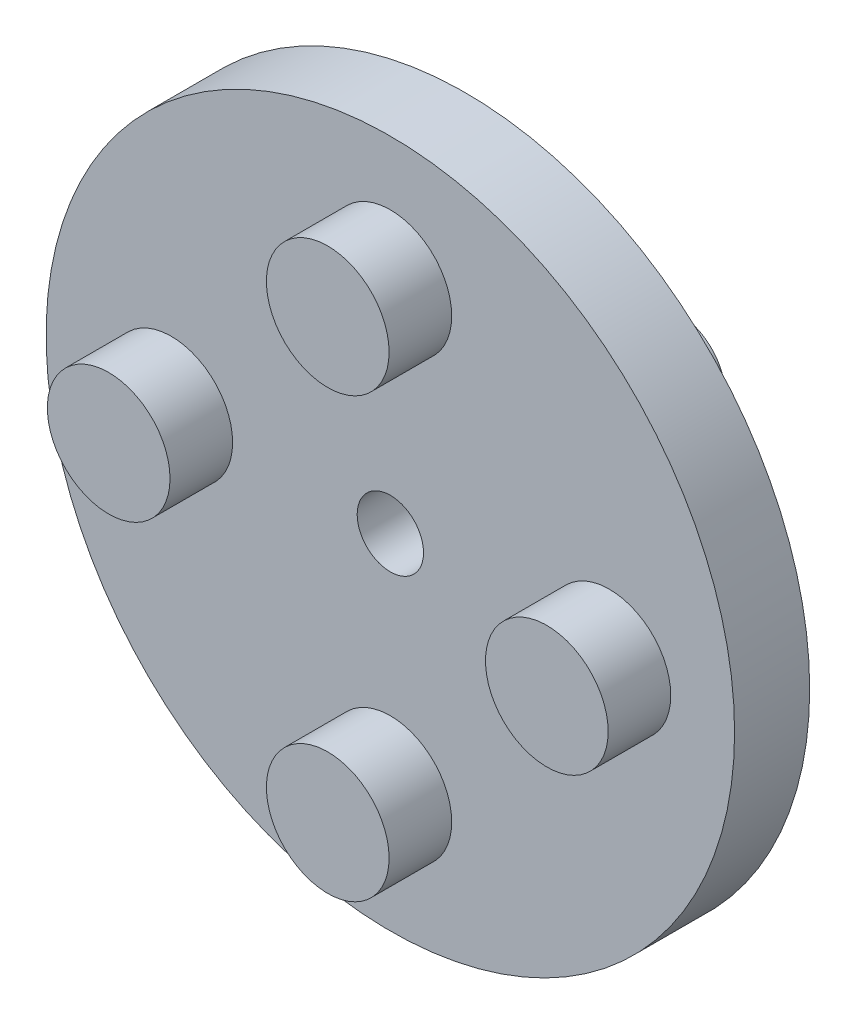
ISO-10303-21;
HEADER;
FILE_DESCRIPTION(('STEP AP214'),'2;1');
FILE_NAME('part.step','',(''),(''),'','','');
FILE_SCHEMA(('AUTOMOTIVE_DESIGN { 1 0 10303 214 1 1 1 1 }'));
ENDSEC;
DATA;
#1=APPLICATION_CONTEXT('core data for automotive mechanical design processes');
#2=APPLICATION_PROTOCOL_DEFINITION('international standard','automotive_design',2000,#1);
#3=PRODUCT_CONTEXT('',#1,'mechanical');
#4=PRODUCT('Part','Part','',(#3));
#5=PRODUCT_RELATED_PRODUCT_CATEGORY('part','',(#4));
#6=PRODUCT_DEFINITION_FORMATION('','',#4);
#7=PRODUCT_DEFINITION_CONTEXT('part definition',#1,'design');
#8=PRODUCT_DEFINITION('design','',#6,#7);
#9=PRODUCT_DEFINITION_SHAPE('','',#8);
#10=(LENGTH_UNIT() NAMED_UNIT(*) SI_UNIT(.MILLI.,.METRE.));
#11=(NAMED_UNIT(*) PLANE_ANGLE_UNIT() SI_UNIT($,.RADIAN.));
#12=(NAMED_UNIT(*) SI_UNIT($,.STERADIAN.) SOLID_ANGLE_UNIT());
#13=UNCERTAINTY_MEASURE_WITH_UNIT(LENGTH_MEASURE(1.E-05),#10,'distance_accuracy_value','');
#14=(GEOMETRIC_REPRESENTATION_CONTEXT(3) GLOBAL_UNCERTAINTY_ASSIGNED_CONTEXT((#13)) GLOBAL_UNIT_ASSIGNED_CONTEXT((#10,
#11,#12)) REPRESENTATION_CONTEXT('',''));
#15=CARTESIAN_POINT('',(0.,0.,0.));
#16=DIRECTION('',(0.,0.,1.));
#17=DIRECTION('',(1.,0.,0.));
#18=AXIS2_PLACEMENT_3D('',#15,#16,#17);
#19=CARTESIAN_POINT('',(0.,0.,0.));
#20=DIRECTION('',(0.,0.,1.));
#21=DIRECTION('',(1.,0.,0.));
#22=AXIS2_PLACEMENT_3D('',#19,#20,#21);
#23=PLANE('',#22);
#24=CARTESIAN_POINT('',(0.,0.,0.));
#25=DIRECTION('',(0.,0.,1.));
#26=DIRECTION('',(1.,0.,0.));
#27=AXIS2_PLACEMENT_3D('',#24,#25,#26);
#28=CIRCLE('',#27,27.5);
#29=CARTESIAN_POINT('',(27.5,0.,0.));
#30=VERTEX_POINT('',#29);
#31=EDGE_CURVE('E48',#30,#30,#28,.T.);
#32=ORIENTED_EDGE('',*,*,#31,.F.);
#33=EDGE_LOOP('',(#32));
#34=FACE_BOUND('',#33,.T.);
#35=CARTESIAN_POINT('',(0.,0.,0.));
#36=DIRECTION('',(0.,0.,1.));
#37=DIRECTION('',(1.,0.,0.));
#38=AXIS2_PLACEMENT_3D('',#35,#36,#37);
#39=CIRCLE('',#38,3.75);
#40=CARTESIAN_POINT('',(3.75,0.,0.));
#41=VERTEX_POINT('',#40);
#42=EDGE_CURVE('E10',#41,#41,#39,.F.);
#43=ORIENTED_EDGE('',*,*,#42,.F.);
#44=EDGE_LOOP('',(#43));
#45=FACE_BOUND('',#44,.T.);
#46=ADVANCED_FACE('F37',(#34,#45),#23,.F.);
#47=CARTESIAN_POINT('',(0.,0.,6.));
#48=DIRECTION('',(0.,0.,1.));
#49=DIRECTION('',(1.,0.,0.));
#50=AXIS2_PLACEMENT_3D('',#47,#48,#49);
#51=PLANE('',#50);
#52=CARTESIAN_POINT('',(-17.5000000000001,0.,6.));
#53=DIRECTION('',(0.,0.,1.));
#54=DIRECTION('',(1.,0.,0.));
#55=AXIS2_PLACEMENT_3D('',#52,#53,#54);
#56=CIRCLE('',#55,4.9);
#57=CARTESIAN_POINT('',(-12.6000000000001,0.,6.));
#58=VERTEX_POINT('',#57);
#59=EDGE_CURVE('E73',#58,#58,#56,.T.);
#60=ORIENTED_EDGE('',*,*,#59,.F.);
#61=EDGE_LOOP('',(#60));
#62=FACE_BOUND('',#61,.T.);
#63=CARTESIAN_POINT('',(-1.22298005056365E-13,-17.5,6.));
#64=DIRECTION('',(0.,0.,1.));
#65=DIRECTION('',(1.,0.,0.));
#66=AXIS2_PLACEMENT_3D('',#63,#64,#65);
#67=CIRCLE('',#66,4.9);
#68=CARTESIAN_POINT('',(4.89999999999988,-17.5,6.));
#69=VERTEX_POINT('',#68);
#70=EDGE_CURVE('E67',#69,#69,#67,.T.);
#71=ORIENTED_EDGE('',*,*,#70,.F.);
#72=EDGE_LOOP('',(#71));
#73=FACE_BOUND('',#72,.T.);
#74=CARTESIAN_POINT('',(17.5,0.,6.));
#75=DIRECTION('',(0.,0.,1.));
#76=DIRECTION('',(1.,0.,0.));
#77=AXIS2_PLACEMENT_3D('',#74,#75,#76);
#78=CIRCLE('',#77,4.9);
#79=CARTESIAN_POINT('',(22.4,0.,6.));
#80=VERTEX_POINT('',#79);
#81=EDGE_CURVE('E61',#80,#80,#78,.T.);
#82=ORIENTED_EDGE('',*,*,#81,.F.);
#83=EDGE_LOOP('',(#82));
#84=FACE_BOUND('',#83,.T.);
#85=CARTESIAN_POINT('',(0.,17.5,6.));
#86=DIRECTION('',(0.,0.,1.));
#87=DIRECTION('',(1.,0.,0.));
#88=AXIS2_PLACEMENT_3D('',#85,#86,#87);
#89=CIRCLE('',#88,4.9);
#90=CARTESIAN_POINT('',(4.9,17.5,6.));
#91=VERTEX_POINT('',#90);
#92=EDGE_CURVE('E58',#91,#91,#89,.T.);
#93=ORIENTED_EDGE('',*,*,#92,.F.);
#94=EDGE_LOOP('',(#93));
#95=FACE_BOUND('',#94,.T.);
#96=CARTESIAN_POINT('',(0.,0.,6.));
#97=DIRECTION('',(0.,0.,1.));
#98=DIRECTION('',(1.,0.,0.));
#99=AXIS2_PLACEMENT_3D('',#96,#97,#98);
#100=CIRCLE('',#99,27.5);
#101=CARTESIAN_POINT('',(27.5,0.,6.));
#102=VERTEX_POINT('',#101);
#103=EDGE_CURVE('E44',#102,#102,#100,.T.);
#104=ORIENTED_EDGE('',*,*,#103,.T.);
#105=EDGE_LOOP('',(#104));
#106=FACE_BOUND('',#105,.T.);
#107=CARTESIAN_POINT('',(0.,0.,6.));
#108=DIRECTION('',(0.,0.,1.));
#109=DIRECTION('',(1.,0.,0.));
#110=AXIS2_PLACEMENT_3D('',#107,#108,#109);
#111=CIRCLE('',#110,2.65);
#112=CARTESIAN_POINT('',(2.65,0.,6.));
#113=VERTEX_POINT('',#112);
#114=EDGE_CURVE('E53',#113,#113,#111,.T.);
#115=ORIENTED_EDGE('',*,*,#114,.F.);
#116=EDGE_LOOP('',(#115));
#117=FACE_BOUND('',#116,.T.);
#118=ADVANCED_FACE('F107',(#62,#73,#84,#95,#106,#117),#51,.T.);
#119=CARTESIAN_POINT('',(0.,0.,6.));
#120=DIRECTION('',(0.,0.,-1.));
#121=DIRECTION('',(-1.,0.,0.));
#122=AXIS2_PLACEMENT_3D('',#119,#120,#121);
#123=CYLINDRICAL_SURFACE('',#122,27.5);
#124=ORIENTED_EDGE('',*,*,#103,.F.);
#125=EDGE_LOOP('',(#124));
#126=FACE_BOUND('',#125,.T.);
#127=ORIENTED_EDGE('',*,*,#31,.T.);
#128=EDGE_LOOP('',(#127));
#129=FACE_BOUND('',#128,.T.);
#130=ADVANCED_FACE('F39',(#126,#129),#123,.T.);
#131=CARTESIAN_POINT('',(0.,0.,6.));
#132=DIRECTION('',(0.,0.,-1.));
#133=DIRECTION('',(-1.,0.,0.));
#134=AXIS2_PLACEMENT_3D('',#131,#132,#133);
#135=CYLINDRICAL_SURFACE('',#134,2.65);
#136=ORIENTED_EDGE('',*,*,#114,.T.);
#137=EDGE_LOOP('',(#136));
#138=FACE_BOUND('',#137,.T.);
#139=CARTESIAN_POINT('',(0.,0.,-17.));
#140=DIRECTION('',(0.,0.,-1.));
#141=DIRECTION('',(-1.,0.,0.));
#142=AXIS2_PLACEMENT_3D('',#139,#140,#141);
#143=CIRCLE('',#142,2.65);
#144=CARTESIAN_POINT('',(-2.65,0.,-17.));
#145=VERTEX_POINT('',#144);
#146=EDGE_CURVE('E84',#145,#145,#143,.T.);
#147=ORIENTED_EDGE('',*,*,#146,.T.);
#148=EDGE_LOOP('',(#147));
#149=FACE_BOUND('',#148,.T.);
#150=ADVANCED_FACE('F88',(#138,#149),#135,.F.);
#151=CARTESIAN_POINT('',(0.,17.5,11.));
#152=DIRECTION('',(0.,0.,-1.));
#153=DIRECTION('',(-1.,0.,0.));
#154=AXIS2_PLACEMENT_3D('',#151,#152,#153);
#155=CYLINDRICAL_SURFACE('',#154,4.9);
#156=CARTESIAN_POINT('',(0.,17.5,11.));
#157=DIRECTION('',(0.,0.,1.));
#158=DIRECTION('',(1.,0.,0.));
#159=AXIS2_PLACEMENT_3D('',#156,#157,#158);
#160=CIRCLE('',#159,4.9);
#161=CARTESIAN_POINT('',(4.9,17.5,11.));
#162=VERTEX_POINT('',#161);
#163=EDGE_CURVE('E57',#162,#162,#160,.T.);
#164=ORIENTED_EDGE('',*,*,#163,.F.);
#165=EDGE_LOOP('',(#164));
#166=FACE_BOUND('',#165,.T.);
#167=ORIENTED_EDGE('',*,*,#92,.T.);
#168=EDGE_LOOP('',(#167));
#169=FACE_BOUND('',#168,.T.);
#170=ADVANCED_FACE('F118',(#166,#169),#155,.T.);
#171=CARTESIAN_POINT('',(0.,17.5,11.));
#172=DIRECTION('',(0.,0.,1.));
#173=DIRECTION('',(1.,0.,0.));
#174=AXIS2_PLACEMENT_3D('',#171,#172,#173);
#175=PLANE('',#174);
#176=ORIENTED_EDGE('',*,*,#163,.T.);
#177=EDGE_LOOP('',(#176));
#178=FACE_BOUND('',#177,.T.);
#179=ADVANCED_FACE('F122',(#178),#175,.T.);
#180=CARTESIAN_POINT('',(17.5,0.,11.));
#181=DIRECTION('',(0.,0.,-1.));
#182=DIRECTION('',(-1.,0.,0.));
#183=AXIS2_PLACEMENT_3D('',#180,#181,#182);
#184=CYLINDRICAL_SURFACE('',#183,4.9);
#185=CARTESIAN_POINT('',(17.5,0.,11.));
#186=DIRECTION('',(0.,0.,1.));
#187=DIRECTION('',(1.,0.,0.));
#188=AXIS2_PLACEMENT_3D('',#185,#186,#187);
#189=CIRCLE('',#188,4.9);
#190=CARTESIAN_POINT('',(22.4,0.,11.));
#191=VERTEX_POINT('',#190);
#192=EDGE_CURVE('E64',#191,#191,#189,.T.);
#193=ORIENTED_EDGE('',*,*,#192,.F.);
#194=EDGE_LOOP('',(#193));
#195=FACE_BOUND('',#194,.T.);
#196=ORIENTED_EDGE('',*,*,#81,.T.);
#197=EDGE_LOOP('',(#196));
#198=FACE_BOUND('',#197,.T.);
#199=ADVANCED_FACE('F126',(#195,#198),#184,.T.);
#200=CARTESIAN_POINT('',(17.5,0.,11.));
#201=DIRECTION('',(0.,0.,1.));
#202=DIRECTION('',(1.,0.,0.));
#203=AXIS2_PLACEMENT_3D('',#200,#201,#202);
#204=PLANE('',#203);
#205=ORIENTED_EDGE('',*,*,#192,.T.);
#206=EDGE_LOOP('',(#205));
#207=FACE_BOUND('',#206,.T.);
#208=ADVANCED_FACE('F128',(#207),#204,.T.);
#209=CARTESIAN_POINT('',(-1.22298005056365E-13,-17.5,11.));
#210=DIRECTION('',(0.,0.,-1.));
#211=DIRECTION('',(-1.,0.,0.));
#212=AXIS2_PLACEMENT_3D('',#209,#210,#211);
#213=CYLINDRICAL_SURFACE('',#212,4.9);
#214=CARTESIAN_POINT('',(-1.22298005056365E-13,-17.5,11.));
#215=DIRECTION('',(0.,0.,1.));
#216=DIRECTION('',(1.,0.,0.));
#217=AXIS2_PLACEMENT_3D('',#214,#215,#216);
#218=CIRCLE('',#217,4.9);
#219=CARTESIAN_POINT('',(4.89999999999988,-17.5,11.));
#220=VERTEX_POINT('',#219);
#221=EDGE_CURVE('E70',#220,#220,#218,.T.);
#222=ORIENTED_EDGE('',*,*,#221,.F.);
#223=EDGE_LOOP('',(#222));
#224=FACE_BOUND('',#223,.T.);
#225=ORIENTED_EDGE('',*,*,#70,.T.);
#226=EDGE_LOOP('',(#225));
#227=FACE_BOUND('',#226,.T.);
#228=ADVANCED_FACE('F131',(#224,#227),#213,.T.);
#229=CARTESIAN_POINT('',(-1.22298005056365E-13,-17.5,11.));
#230=DIRECTION('',(0.,0.,1.));
#231=DIRECTION('',(1.,0.,0.));
#232=AXIS2_PLACEMENT_3D('',#229,#230,#231);
#233=PLANE('',#232);
#234=ORIENTED_EDGE('',*,*,#221,.T.);
#235=EDGE_LOOP('',(#234));
#236=FACE_BOUND('',#235,.T.);
#237=ADVANCED_FACE('F136',(#236),#233,.T.);
#238=CARTESIAN_POINT('',(-17.5000000000001,0.,11.));
#239=DIRECTION('',(0.,0.,-1.));
#240=DIRECTION('',(-1.,0.,0.));
#241=AXIS2_PLACEMENT_3D('',#238,#239,#240);
#242=CYLINDRICAL_SURFACE('',#241,4.9);
#243=CARTESIAN_POINT('',(-17.5000000000001,0.,11.));
#244=DIRECTION('',(0.,0.,1.));
#245=DIRECTION('',(1.,0.,0.));
#246=AXIS2_PLACEMENT_3D('',#243,#244,#245);
#247=CIRCLE('',#246,4.9);
#248=CARTESIAN_POINT('',(-12.6000000000001,0.,11.));
#249=VERTEX_POINT('',#248);
#250=EDGE_CURVE('E76',#249,#249,#247,.T.);
#251=ORIENTED_EDGE('',*,*,#250,.F.);
#252=EDGE_LOOP('',(#251));
#253=FACE_BOUND('',#252,.T.);
#254=ORIENTED_EDGE('',*,*,#59,.T.);
#255=EDGE_LOOP('',(#254));
#256=FACE_BOUND('',#255,.T.);
#257=ADVANCED_FACE('F103',(#253,#256),#242,.T.);
#258=CARTESIAN_POINT('',(-17.5000000000001,0.,11.));
#259=DIRECTION('',(0.,0.,1.));
#260=DIRECTION('',(1.,0.,0.));
#261=AXIS2_PLACEMENT_3D('',#258,#259,#260);
#262=PLANE('',#261);
#263=ORIENTED_EDGE('',*,*,#250,.T.);
#264=EDGE_LOOP('',(#263));
#265=FACE_BOUND('',#264,.T.);
#266=ADVANCED_FACE('F93',(#265),#262,.T.);
#267=CARTESIAN_POINT('',(0.,0.,-17.));
#268=DIRECTION('',(0.,0.,-1.));
#269=DIRECTION('',(-1.,0.,0.));
#270=AXIS2_PLACEMENT_3D('',#267,#268,#269);
#271=PLANE('',#270);
#272=CARTESIAN_POINT('',(0.,0.,-17.));
#273=DIRECTION('',(0.,0.,-1.));
#274=DIRECTION('',(-1.,0.,0.));
#275=AXIS2_PLACEMENT_3D('',#272,#273,#274);
#276=CIRCLE('',#275,3.75);
#277=CARTESIAN_POINT('',(-3.75,0.,-17.));
#278=VERTEX_POINT('',#277);
#279=EDGE_CURVE('E79',#278,#278,#276,.T.);
#280=ORIENTED_EDGE('',*,*,#279,.T.);
#281=EDGE_LOOP('',(#280));
#282=FACE_BOUND('',#281,.T.);
#283=ORIENTED_EDGE('',*,*,#146,.F.);
#284=EDGE_LOOP('',(#283));
#285=FACE_BOUND('',#284,.T.);
#286=ADVANCED_FACE('F90',(#282,#285),#271,.T.);
#287=CARTESIAN_POINT('',(0.,0.,-17.));
#288=DIRECTION('',(0.,0.,1.));
#289=DIRECTION('',(1.,0.,0.));
#290=AXIS2_PLACEMENT_3D('',#287,#288,#289);
#291=CYLINDRICAL_SURFACE('',#290,3.75);
#292=ORIENTED_EDGE('',*,*,#279,.F.);
#293=EDGE_LOOP('',(#292));
#294=FACE_BOUND('',#293,.T.);
#295=ORIENTED_EDGE('',*,*,#42,.T.);
#296=EDGE_LOOP('',(#295));
#297=FACE_BOUND('',#296,.T.);
#298=ADVANCED_FACE('F92',(#294,#297),#291,.T.);
#299=CLOSED_SHELL('',(#46,#118,#130,#150,#170,#179,#199,#208,#228,#237,#257,#266,#286,#298));
#300=MANIFOLD_SOLID_BREP('B2',#299);
#301=ADVANCED_BREP_SHAPE_REPRESENTATION('',(#18,#300),#14);
#302=SHAPE_DEFINITION_REPRESENTATION(#9,#301);
ENDSEC;
END-ISO-10303-21;
